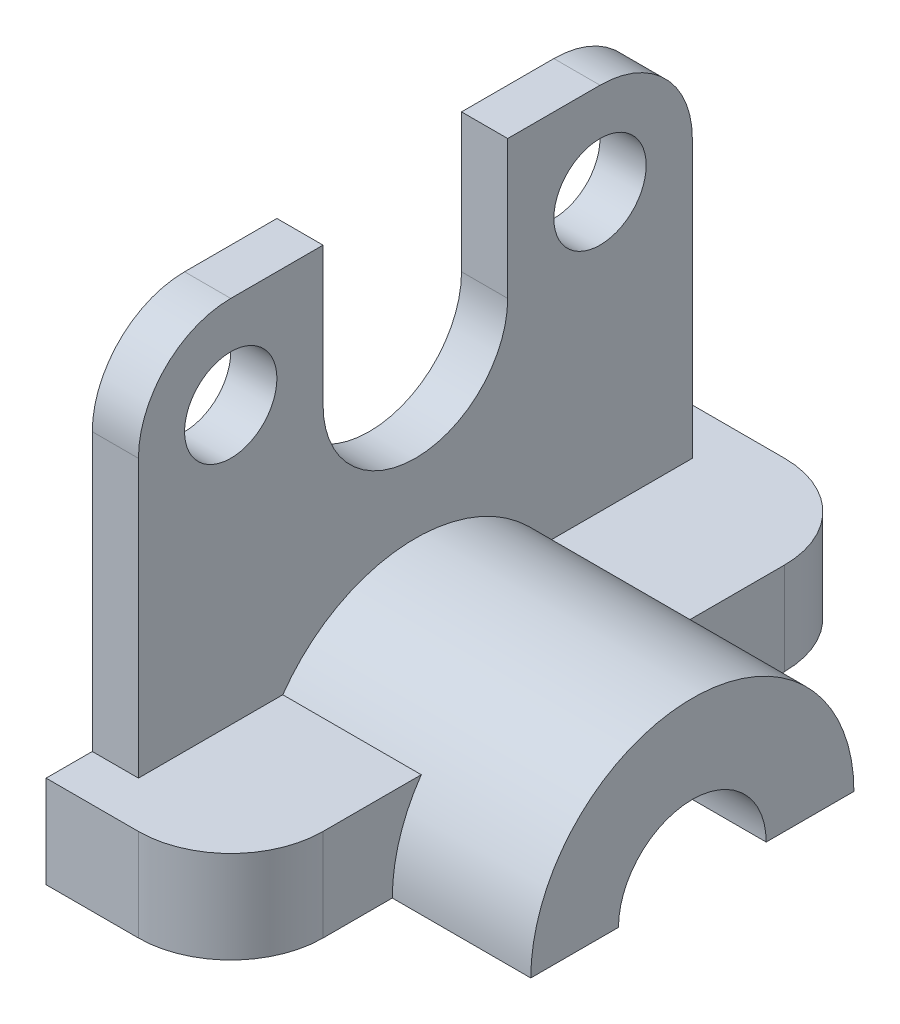
ISO-10303-21;
HEADER;
FILE_DESCRIPTION(('STEP AP214'),'2;1');
FILE_NAME('part.step','',(''),(''),'','','');
FILE_SCHEMA(('AUTOMOTIVE_DESIGN { 1 0 10303 214 1 1 1 1 }'));
ENDSEC;
DATA;
#1=APPLICATION_CONTEXT('core data for automotive mechanical design processes');
#2=APPLICATION_PROTOCOL_DEFINITION('international standard','automotive_design',2000,#1);
#3=PRODUCT_CONTEXT('',#1,'mechanical');
#4=PRODUCT('Part','Part','',(#3));
#5=PRODUCT_RELATED_PRODUCT_CATEGORY('part','',(#4));
#6=PRODUCT_DEFINITION_FORMATION('','',#4);
#7=PRODUCT_DEFINITION_CONTEXT('part definition',#1,'design');
#8=PRODUCT_DEFINITION('design','',#6,#7);
#9=PRODUCT_DEFINITION_SHAPE('','',#8);
#10=(LENGTH_UNIT() NAMED_UNIT(*) SI_UNIT(.MILLI.,.METRE.));
#11=(NAMED_UNIT(*) PLANE_ANGLE_UNIT() SI_UNIT($,.RADIAN.));
#12=(NAMED_UNIT(*) SI_UNIT($,.STERADIAN.) SOLID_ANGLE_UNIT());
#13=UNCERTAINTY_MEASURE_WITH_UNIT(LENGTH_MEASURE(1.E-05),#10,'distance_accuracy_value','');
#14=(GEOMETRIC_REPRESENTATION_CONTEXT(3) GLOBAL_UNCERTAINTY_ASSIGNED_CONTEXT((#13)) GLOBAL_UNIT_ASSIGNED_CONTEXT((#10,
#11,#12)) REPRESENTATION_CONTEXT('',''));
#15=CARTESIAN_POINT('',(0.,0.,0.));
#16=DIRECTION('',(0.,0.,1.));
#17=DIRECTION('',(1.,0.,0.));
#18=AXIS2_PLACEMENT_3D('',#15,#16,#17);
#19=CARTESIAN_POINT('',(20.,-10.,0.));
#20=DIRECTION('',(0.,-1.,0.));
#21=DIRECTION('',(0.,0.,-1.));
#22=AXIS2_PLACEMENT_3D('',#19,#20,#21);
#23=PLANE('',#22);
#24=DIRECTION('',(1.,0.,0.));
#25=VECTOR('',#24,1.);
#26=CARTESIAN_POINT('',(-34.1311896062463,-10.,-43.));
#27=LINE('',#26,#25);
#28=CARTESIAN_POINT('',(0.,-10.,-43.));
#29=VERTEX_POINT('',#28);
#30=CARTESIAN_POINT('',(35.,-10.,-43.));
#31=VERTEX_POINT('',#30);
#32=EDGE_CURVE('E184',#29,#31,#27,.T.);
#33=ORIENTED_EDGE('',*,*,#32,.F.);
#34=DIRECTION('',(0.,0.,1.));
#35=VECTOR('',#34,1.);
#36=CARTESIAN_POINT('',(0.,-10.,0.));
#37=LINE('',#36,#35);
#38=CARTESIAN_POINT('',(0.,-10.,-70.));
#39=VERTEX_POINT('',#38);
#40=EDGE_CURVE('E188',#39,#29,#37,.T.);
#41=ORIENTED_EDGE('',*,*,#40,.F.);
#42=DIRECTION('',(-1.,0.,0.));
#43=VECTOR('',#42,1.);
#44=CARTESIAN_POINT('',(20.,-10.,-70.));
#45=LINE('',#44,#43);
#46=CARTESIAN_POINT('',(10.,-10.,-70.));
#47=VERTEX_POINT('',#46);
#48=EDGE_CURVE('E225',#47,#39,#45,.T.);
#49=ORIENTED_EDGE('',*,*,#48,.F.);
#50=CARTESIAN_POINT('',(10.,-10.,-60.));
#51=DIRECTION('',(0.,-1.,0.));
#52=DIRECTION('',(0.,0.,-1.));
#53=AXIS2_PLACEMENT_3D('',#50,#51,#52);
#54=CIRCLE('',#53,10.);
#55=CARTESIAN_POINT('',(20.,-10.,-60.));
#56=VERTEX_POINT('',#55);
#57=EDGE_CURVE('E290',#47,#56,#54,.T.);
#58=ORIENTED_EDGE('',*,*,#57,.T.);
#59=DIRECTION('',(0.,0.,1.));
#60=VECTOR('',#59,1.);
#61=CARTESIAN_POINT('',(20.,-10.,0.));
#62=LINE('',#61,#60);
#63=CARTESIAN_POINT('',(20.,-10.,-52.5));
#64=VERTEX_POINT('',#63);
#65=EDGE_CURVE('E240',#56,#64,#62,.T.);
#66=ORIENTED_EDGE('',*,*,#65,.T.);
#67=DIRECTION('',(1.,0.,0.));
#68=VECTOR('',#67,1.);
#69=CARTESIAN_POINT('',(-34.1311896062463,-10.,-52.5));
#70=LINE('',#69,#68);
#71=CARTESIAN_POINT('',(35.,-10.,-52.5));
#72=VERTEX_POINT('',#71);
#73=EDGE_CURVE('E195',#64,#72,#70,.T.);
#74=ORIENTED_EDGE('',*,*,#73,.T.);
#75=DIRECTION('',(0.,0.,-1.));
#76=VECTOR('',#75,1.);
#77=CARTESIAN_POINT('',(35.,-10.,-43.));
#78=LINE('',#77,#76);
#79=EDGE_CURVE('E191',#31,#72,#78,.T.);
#80=ORIENTED_EDGE('',*,*,#79,.F.);
#81=EDGE_LOOP('',(#33,#41,#49,#58,#66,#74,#80));
#82=FACE_BOUND('',#81,.T.);
#83=ADVANCED_FACE('F33',(#82),#23,.T.);
#84=CARTESIAN_POINT('',(20.,0.,0.));
#85=DIRECTION('',(0.,1.,0.));
#86=DIRECTION('',(0.,0.,1.));
#87=AXIS2_PLACEMENT_3D('',#84,#85,#86);
#88=PLANE('',#87);
#89=DIRECTION('',(1.,0.,0.));
#90=VECTOR('',#89,1.);
#91=CARTESIAN_POINT('',(-34.1311896062463,0.,-20.6385933836549));
#92=LINE('',#91,#90);
#93=CARTESIAN_POINT('',(5.,0.,-20.6385933836549));
#94=VERTEX_POINT('',#93);
#95=CARTESIAN_POINT('',(20.,0.,-20.6385933836549));
#96=VERTEX_POINT('',#95);
#97=EDGE_CURVE('E307',#94,#96,#92,.T.);
#98=ORIENTED_EDGE('',*,*,#97,.F.);
#99=DIRECTION('',(0.,0.,-1.));
#100=VECTOR('',#99,1.);
#101=CARTESIAN_POINT('',(5.,0.,0.));
#102=LINE('',#101,#100);
#103=CARTESIAN_POINT('',(5.,0.,-5.));
#104=VERTEX_POINT('',#103);
#105=EDGE_CURVE('E315',#104,#94,#102,.T.);
#106=ORIENTED_EDGE('',*,*,#105,.F.);
#107=DIRECTION('',(-1.,0.,0.));
#108=VECTOR('',#107,1.);
#109=CARTESIAN_POINT('',(5.,0.,-5.));
#110=LINE('',#109,#108);
#111=CARTESIAN_POINT('',(0.,0.,-5.));
#112=VERTEX_POINT('',#111);
#113=EDGE_CURVE('E264',#104,#112,#110,.T.);
#114=ORIENTED_EDGE('',*,*,#113,.T.);
#115=DIRECTION('',(0.,0.,-1.));
#116=VECTOR('',#115,1.);
#117=CARTESIAN_POINT('',(0.,0.,0.));
#118=LINE('',#117,#116);
#119=CARTESIAN_POINT('',(0.,0.,0.));
#120=VERTEX_POINT('',#119);
#121=EDGE_CURVE('E222',#120,#112,#118,.T.);
#122=ORIENTED_EDGE('',*,*,#121,.F.);
#123=DIRECTION('',(-1.,0.,0.));
#124=VECTOR('',#123,1.);
#125=CARTESIAN_POINT('',(20.,0.,0.));
#126=LINE('',#125,#124);
#127=CARTESIAN_POINT('',(10.,0.,0.));
#128=VERTEX_POINT('',#127);
#129=EDGE_CURVE('E230',#128,#120,#126,.T.);
#130=ORIENTED_EDGE('',*,*,#129,.F.);
#131=CARTESIAN_POINT('',(10.,0.,-10.));
#132=DIRECTION('',(0.,1.,0.));
#133=DIRECTION('',(0.,0.,1.));
#134=AXIS2_PLACEMENT_3D('',#131,#132,#133);
#135=CIRCLE('',#134,10.);
#136=CARTESIAN_POINT('',(20.,0.,-10.));
#137=VERTEX_POINT('',#136);
#138=EDGE_CURVE('E297',#128,#137,#135,.T.);
#139=ORIENTED_EDGE('',*,*,#138,.T.);
#140=DIRECTION('',(0.,0.,-1.));
#141=VECTOR('',#140,1.);
#142=CARTESIAN_POINT('',(20.,0.,0.));
#143=LINE('',#142,#141);
#144=EDGE_CURVE('E211',#137,#96,#143,.T.);
#145=ORIENTED_EDGE('',*,*,#144,.T.);
#146=EDGE_LOOP('',(#98,#106,#114,#122,#130,#139,#145));
#147=FACE_BOUND('',#146,.T.);
#148=ADVANCED_FACE('F418',(#147),#88,.T.);
#149=CARTESIAN_POINT('',(20.,0.,0.));
#150=DIRECTION('',(1.,0.,0.));
#151=DIRECTION('',(0.,0.,-1.));
#152=AXIS2_PLACEMENT_3D('',#149,#150,#151);
#153=PLANE('',#152);
#154=CARTESIAN_POINT('',(20.,-10.,-35.));
#155=DIRECTION('',(1.,0.,0.));
#156=DIRECTION('',(0.,0.,-1.));
#157=AXIS2_PLACEMENT_3D('',#154,#155,#156);
#158=CIRCLE('',#157,17.5);
#159=CARTESIAN_POINT('',(20.,0.,-49.3614066163451));
#160=VERTEX_POINT('',#159);
#161=EDGE_CURVE('E405',#64,#160,#158,.T.);
#162=ORIENTED_EDGE('',*,*,#161,.F.);
#163=ORIENTED_EDGE('',*,*,#65,.F.);
#164=DIRECTION('',(0.,-1.,0.));
#165=VECTOR('',#164,1.);
#166=CARTESIAN_POINT('',(20.,0.,-60.));
#167=LINE('',#166,#165);
#168=CARTESIAN_POINT('',(20.,0.,-60.));
#169=VERTEX_POINT('',#168);
#170=EDGE_CURVE('E295',#56,#169,#167,.F.);
#171=ORIENTED_EDGE('',*,*,#170,.T.);
#172=EDGE_CURVE('E236',#160,#169,#143,.T.);
#173=ORIENTED_EDGE('',*,*,#172,.F.);
#174=EDGE_LOOP('',(#162,#163,#171,#173));
#175=FACE_BOUND('',#174,.T.);
#176=ADVANCED_FACE('F403',(#175),#153,.T.);
#177=CARTESIAN_POINT('',(20.,-10.,-17.5));
#178=VERTEX_POINT('',#177);
#179=EDGE_CURVE('E56',#96,#178,#158,.T.);
#180=ORIENTED_EDGE('',*,*,#179,.F.);
#181=ORIENTED_EDGE('',*,*,#144,.F.);
#182=DIRECTION('',(0.,1.,0.));
#183=VECTOR('',#182,1.);
#184=CARTESIAN_POINT('',(20.,0.,-10.));
#185=LINE('',#184,#183);
#186=CARTESIAN_POINT('',(20.,-10.,-10.));
#187=VERTEX_POINT('',#186);
#188=EDGE_CURVE('E292',#137,#187,#185,.F.);
#189=ORIENTED_EDGE('',*,*,#188,.T.);
#190=EDGE_CURVE('E243',#178,#187,#62,.T.);
#191=ORIENTED_EDGE('',*,*,#190,.F.);
#192=EDGE_LOOP('',(#180,#181,#189,#191));
#193=FACE_BOUND('',#192,.T.);
#194=ADVANCED_FACE('F426',(#193),#153,.T.);
#195=CARTESIAN_POINT('',(0.,-10.,-27.));
#196=VERTEX_POINT('',#195);
#197=CARTESIAN_POINT('',(0.,-10.,0.));
#198=VERTEX_POINT('',#197);
#199=EDGE_CURVE('E205',#196,#198,#37,.T.);
#200=ORIENTED_EDGE('',*,*,#199,.F.);
#201=DIRECTION('',(1.,0.,0.));
#202=VECTOR('',#201,1.);
#203=CARTESIAN_POINT('',(-34.1311896062463,-10.,-27.));
#204=LINE('',#203,#202);
#205=CARTESIAN_POINT('',(35.,-10.,-27.));
#206=VERTEX_POINT('',#205);
#207=EDGE_CURVE('E196',#196,#206,#204,.T.);
#208=ORIENTED_EDGE('',*,*,#207,.T.);
#209=DIRECTION('',(0.,0.,-1.));
#210=VECTOR('',#209,1.);
#211=CARTESIAN_POINT('',(35.,-10.,-17.5));
#212=LINE('',#211,#210);
#213=CARTESIAN_POINT('',(35.,-10.,-17.5));
#214=VERTEX_POINT('',#213);
#215=EDGE_CURVE('E663',#214,#206,#212,.T.);
#216=ORIENTED_EDGE('',*,*,#215,.F.);
#217=DIRECTION('',(1.,0.,0.));
#218=VECTOR('',#217,1.);
#219=CARTESIAN_POINT('',(-34.1311896062463,-10.,-17.5));
#220=LINE('',#219,#218);
#221=EDGE_CURVE('E670',#178,#214,#220,.T.);
#222=ORIENTED_EDGE('',*,*,#221,.F.);
#223=ORIENTED_EDGE('',*,*,#190,.T.);
#224=CARTESIAN_POINT('',(10.,-10.,-10.));
#225=DIRECTION('',(0.,-1.,0.));
#226=DIRECTION('',(0.,0.,-1.));
#227=AXIS2_PLACEMENT_3D('',#224,#225,#226);
#228=CIRCLE('',#227,10.);
#229=CARTESIAN_POINT('',(10.,-10.,0.));
#230=VERTEX_POINT('',#229);
#231=EDGE_CURVE('E288',#187,#230,#228,.T.);
#232=ORIENTED_EDGE('',*,*,#231,.T.);
#233=DIRECTION('',(-1.,0.,0.));
#234=VECTOR('',#233,1.);
#235=CARTESIAN_POINT('',(20.,-10.,0.));
#236=LINE('',#235,#234);
#237=EDGE_CURVE('E231',#230,#198,#236,.T.);
#238=ORIENTED_EDGE('',*,*,#237,.T.);
#239=EDGE_LOOP('',(#200,#208,#216,#222,#223,#232,#238));
#240=FACE_BOUND('',#239,.T.);
#241=ADVANCED_FACE('F419',(#240),#23,.T.);
#242=CARTESIAN_POINT('',(20.,0.,-70.));
#243=DIRECTION('',(0.,0.,-1.));
#244=DIRECTION('',(-1.,0.,0.));
#245=AXIS2_PLACEMENT_3D('',#242,#243,#244);
#246=PLANE('',#245);
#247=DIRECTION('',(-1.,0.,0.));
#248=VECTOR('',#247,1.);
#249=CARTESIAN_POINT('',(20.,0.,-70.));
#250=LINE('',#249,#248);
#251=CARTESIAN_POINT('',(10.,0.,-70.));
#252=VERTEX_POINT('',#251);
#253=CARTESIAN_POINT('',(0.,0.,-70.));
#254=VERTEX_POINT('',#253);
#255=EDGE_CURVE('E228',#252,#254,#250,.T.);
#256=ORIENTED_EDGE('',*,*,#255,.F.);
#257=DIRECTION('',(0.,-1.,0.));
#258=VECTOR('',#257,1.);
#259=CARTESIAN_POINT('',(10.,0.,-70.));
#260=LINE('',#259,#258);
#261=EDGE_CURVE('E227',#252,#47,#260,.T.);
#262=ORIENTED_EDGE('',*,*,#261,.T.);
#263=ORIENTED_EDGE('',*,*,#48,.T.);
#264=DIRECTION('',(0.,-1.,0.));
#265=VECTOR('',#264,1.);
#266=CARTESIAN_POINT('',(0.,0.,-70.));
#267=LINE('',#266,#265);
#268=EDGE_CURVE('E204',#254,#39,#267,.T.);
#269=ORIENTED_EDGE('',*,*,#268,.F.);
#270=EDGE_LOOP('',(#256,#262,#263,#269));
#271=FACE_BOUND('',#270,.T.);
#272=ADVANCED_FACE('F398',(#271),#246,.T.);
#273=DIRECTION('',(1.,0.,0.));
#274=VECTOR('',#273,1.);
#275=CARTESIAN_POINT('',(-34.1311896062463,0.,-49.3614066163451));
#276=LINE('',#275,#274);
#277=CARTESIAN_POINT('',(5.,0.,-49.3614066163451));
#278=VERTEX_POINT('',#277);
#279=EDGE_CURVE('E48',#160,#278,#276,.F.);
#280=ORIENTED_EDGE('',*,*,#279,.F.);
#281=ORIENTED_EDGE('',*,*,#172,.T.);
#282=CARTESIAN_POINT('',(10.,0.,-60.));
#283=DIRECTION('',(0.,1.,0.));
#284=DIRECTION('',(0.,0.,1.));
#285=AXIS2_PLACEMENT_3D('',#282,#283,#284);
#286=CIRCLE('',#285,10.);
#287=EDGE_CURVE('E299',#169,#252,#286,.T.);
#288=ORIENTED_EDGE('',*,*,#287,.T.);
#289=ORIENTED_EDGE('',*,*,#255,.T.);
#290=CARTESIAN_POINT('',(0.,0.,-65.));
#291=VERTEX_POINT('',#290);
#292=EDGE_CURVE('E207',#291,#254,#118,.T.);
#293=ORIENTED_EDGE('',*,*,#292,.F.);
#294=DIRECTION('',(-1.,0.,0.));
#295=VECTOR('',#294,1.);
#296=CARTESIAN_POINT('',(5.,0.,-65.));
#297=LINE('',#296,#295);
#298=CARTESIAN_POINT('',(5.,0.,-65.));
#299=VERTEX_POINT('',#298);
#300=EDGE_CURVE('E209',#299,#291,#297,.T.);
#301=ORIENTED_EDGE('',*,*,#300,.F.);
#302=EDGE_CURVE('E311',#278,#299,#102,.T.);
#303=ORIENTED_EDGE('',*,*,#302,.F.);
#304=EDGE_LOOP('',(#280,#281,#288,#289,#293,#301,#303));
#305=FACE_BOUND('',#304,.T.);
#306=ADVANCED_FACE('F317',(#305),#88,.T.);
#307=CARTESIAN_POINT('',(20.,0.,0.));
#308=DIRECTION('',(0.,0.,1.));
#309=DIRECTION('',(1.,0.,0.));
#310=AXIS2_PLACEMENT_3D('',#307,#308,#309);
#311=PLANE('',#310);
#312=ORIENTED_EDGE('',*,*,#237,.F.);
#313=DIRECTION('',(0.,1.,0.));
#314=VECTOR('',#313,1.);
#315=CARTESIAN_POINT('',(10.,0.,0.));
#316=LINE('',#315,#314);
#317=EDGE_CURVE('E301',#230,#128,#316,.T.);
#318=ORIENTED_EDGE('',*,*,#317,.T.);
#319=ORIENTED_EDGE('',*,*,#129,.T.);
#320=DIRECTION('',(0.,1.,0.));
#321=VECTOR('',#320,1.);
#322=CARTESIAN_POINT('',(0.,0.,0.));
#323=LINE('',#322,#321);
#324=EDGE_CURVE('E216',#198,#120,#323,.T.);
#325=ORIENTED_EDGE('',*,*,#324,.F.);
#326=EDGE_LOOP('',(#312,#318,#319,#325));
#327=FACE_BOUND('',#326,.T.);
#328=ADVANCED_FACE('F436',(#327),#311,.T.);
#329=CARTESIAN_POINT('',(0.,0.,0.));
#330=DIRECTION('',(1.,0.,0.));
#331=DIRECTION('',(0.,0.,-1.));
#332=AXIS2_PLACEMENT_3D('',#329,#330,#331);
#333=PLANE('',#332);
#334=CARTESIAN_POINT('',(0.,30.,-55.));
#335=DIRECTION('',(1.,0.,0.));
#336=DIRECTION('',(0.,0.,-1.));
#337=AXIS2_PLACEMENT_3D('',#334,#335,#336);
#338=CIRCLE('',#337,5.);
#339=CARTESIAN_POINT('',(0.,30.,-60.));
#340=VERTEX_POINT('',#339);
#341=EDGE_CURVE('E680',#340,#340,#338,.T.);
#342=ORIENTED_EDGE('',*,*,#341,.T.);
#343=EDGE_LOOP('',(#342));
#344=FACE_BOUND('',#343,.T.);
#345=CARTESIAN_POINT('',(0.,30.,-15.));
#346=DIRECTION('',(1.,0.,0.));
#347=DIRECTION('',(0.,0.,-1.));
#348=AXIS2_PLACEMENT_3D('',#345,#346,#347);
#349=CIRCLE('',#348,5.);
#350=CARTESIAN_POINT('',(0.,30.,-20.));
#351=VERTEX_POINT('',#350);
#352=EDGE_CURVE('E279',#351,#351,#349,.T.);
#353=ORIENTED_EDGE('',*,*,#352,.T.);
#354=EDGE_LOOP('',(#353));
#355=FACE_BOUND('',#354,.T.);
#356=ORIENTED_EDGE('',*,*,#40,.T.);
#357=CARTESIAN_POINT('',(0.,-10.,-35.));
#358=DIRECTION('',(1.,0.,0.));
#359=DIRECTION('',(0.,0.,-1.));
#360=AXIS2_PLACEMENT_3D('',#357,#358,#359);
#361=CIRCLE('',#360,8.);
#362=EDGE_CURVE('E11',#29,#196,#361,.T.);
#363=ORIENTED_EDGE('',*,*,#362,.T.);
#364=ORIENTED_EDGE('',*,*,#199,.T.);
#365=ORIENTED_EDGE('',*,*,#324,.T.);
#366=ORIENTED_EDGE('',*,*,#121,.T.);
#367=DIRECTION('',(0.,1.,0.));
#368=VECTOR('',#367,1.);
#369=CARTESIAN_POINT('',(0.,0.,-5.));
#370=LINE('',#369,#368);
#371=CARTESIAN_POINT('',(0.,30.,-5.));
#372=VERTEX_POINT('',#371);
#373=EDGE_CURVE('E319',#112,#372,#370,.T.);
#374=ORIENTED_EDGE('',*,*,#373,.T.);
#375=CARTESIAN_POINT('',(0.,30.,-15.));
#376=DIRECTION('',(1.,0.,0.));
#377=DIRECTION('',(0.,0.,-1.));
#378=AXIS2_PLACEMENT_3D('',#375,#376,#377);
#379=CIRCLE('',#378,9.99999999999999);
#380=CARTESIAN_POINT('',(0.,40.,-15.));
#381=VERTEX_POINT('',#380);
#382=EDGE_CURVE('E267',#372,#381,#379,.F.);
#383=ORIENTED_EDGE('',*,*,#382,.T.);
#384=DIRECTION('',(0.,0.,-1.));
#385=VECTOR('',#384,1.);
#386=CARTESIAN_POINT('',(0.,40.,0.));
#387=LINE('',#386,#385);
#388=CARTESIAN_POINT('',(0.,40.,-25.));
#389=VERTEX_POINT('',#388);
#390=EDGE_CURVE('E360',#381,#389,#387,.T.);
#391=ORIENTED_EDGE('',*,*,#390,.T.);
#392=DIRECTION('',(0.,-1.,0.));
#393=VECTOR('',#392,1.);
#394=CARTESIAN_POINT('',(0.,0.,-25.));
#395=LINE('',#394,#393);
#396=CARTESIAN_POINT('',(0.,25.,-25.));
#397=VERTEX_POINT('',#396);
#398=EDGE_CURVE('E358',#389,#397,#395,.T.);
#399=ORIENTED_EDGE('',*,*,#398,.T.);
#400=CARTESIAN_POINT('',(0.,25.,-35.));
#401=DIRECTION('',(1.,0.,0.));
#402=DIRECTION('',(0.,0.,-1.));
#403=AXIS2_PLACEMENT_3D('',#400,#401,#402);
#404=CIRCLE('',#403,10.);
#405=CARTESIAN_POINT('',(0.,25.,-45.));
#406=VERTEX_POINT('',#405);
#407=EDGE_CURVE('E355',#397,#406,#404,.T.);
#408=ORIENTED_EDGE('',*,*,#407,.T.);
#409=DIRECTION('',(0.,-1.,0.));
#410=VECTOR('',#409,1.);
#411=CARTESIAN_POINT('',(0.,0.,-45.));
#412=LINE('',#411,#410);
#413=CARTESIAN_POINT('',(0.,40.,-45.));
#414=VERTEX_POINT('',#413);
#415=EDGE_CURVE('E352',#414,#406,#412,.T.);
#416=ORIENTED_EDGE('',*,*,#415,.F.);
#417=DIRECTION('',(0.,0.,1.));
#418=VECTOR('',#417,1.);
#419=CARTESIAN_POINT('',(0.,40.,0.));
#420=LINE('',#419,#418);
#421=CARTESIAN_POINT('',(0.,40.,-55.));
#422=VERTEX_POINT('',#421);
#423=EDGE_CURVE('E350',#422,#414,#420,.T.);
#424=ORIENTED_EDGE('',*,*,#423,.F.);
#425=CARTESIAN_POINT('',(0.,30.,-55.));
#426=DIRECTION('',(1.,0.,0.));
#427=DIRECTION('',(0.,0.,-1.));
#428=AXIS2_PLACEMENT_3D('',#425,#426,#427);
#429=CIRCLE('',#428,9.99999999999999);
#430=CARTESIAN_POINT('',(0.,30.,-65.));
#431=VERTEX_POINT('',#430);
#432=EDGE_CURVE('E278',#422,#431,#429,.F.);
#433=ORIENTED_EDGE('',*,*,#432,.T.);
#434=DIRECTION('',(0.,1.,0.));
#435=VECTOR('',#434,1.);
#436=CARTESIAN_POINT('',(0.,0.,-65.));
#437=LINE('',#436,#435);
#438=EDGE_CURVE('E275',#291,#431,#437,.T.);
#439=ORIENTED_EDGE('',*,*,#438,.F.);
#440=ORIENTED_EDGE('',*,*,#292,.T.);
#441=ORIENTED_EDGE('',*,*,#268,.T.);
#442=EDGE_LOOP('',(#356,#363,#364,#365,#366,#374,#383,#391,#399,#408,#416,#424,#433,#439,#440,#441));
#443=FACE_BOUND('',#442,.T.);
#444=ADVANCED_FACE('F201',(#344,#355,#443),#333,.F.);
#445=CARTESIAN_POINT('',(5.,0.,-65.));
#446=DIRECTION('',(0.,0.,1.));
#447=DIRECTION('',(1.,0.,0.));
#448=AXIS2_PLACEMENT_3D('',#445,#446,#447);
#449=PLANE('',#448);
#450=ORIENTED_EDGE('',*,*,#438,.T.);
#451=DIRECTION('',(-1.,0.,0.));
#452=VECTOR('',#451,1.);
#453=CARTESIAN_POINT('',(5.,30.,-65.));
#454=LINE('',#453,#452);
#455=CARTESIAN_POINT('',(5.,30.,-65.));
#456=VERTEX_POINT('',#455);
#457=EDGE_CURVE('E247',#456,#431,#454,.T.);
#458=ORIENTED_EDGE('',*,*,#457,.F.);
#459=DIRECTION('',(0.,1.,0.));
#460=VECTOR('',#459,1.);
#461=CARTESIAN_POINT('',(5.,0.,-65.));
#462=LINE('',#461,#460);
#463=EDGE_CURVE('E321',#299,#456,#462,.T.);
#464=ORIENTED_EDGE('',*,*,#463,.F.);
#465=ORIENTED_EDGE('',*,*,#300,.T.);
#466=EDGE_LOOP('',(#450,#458,#464,#465));
#467=FACE_BOUND('',#466,.T.);
#468=ADVANCED_FACE('F395',(#467),#449,.F.);
#469=CARTESIAN_POINT('',(5.,30.,-55.));
#470=DIRECTION('',(-1.,0.,0.));
#471=DIRECTION('',(0.,0.,1.));
#472=AXIS2_PLACEMENT_3D('',#469,#470,#471);
#473=CYLINDRICAL_SURFACE('',#472,9.99999999999999);
#474=ORIENTED_EDGE('',*,*,#432,.F.);
#475=DIRECTION('',(-1.,0.,0.));
#476=VECTOR('',#475,1.);
#477=CARTESIAN_POINT('',(5.,40.,-55.));
#478=LINE('',#477,#476);
#479=CARTESIAN_POINT('',(5.,40.,-55.));
#480=VERTEX_POINT('',#479);
#481=EDGE_CURVE('E249',#480,#422,#478,.T.);
#482=ORIENTED_EDGE('',*,*,#481,.F.);
#483=CARTESIAN_POINT('',(5.,30.,-55.));
#484=DIRECTION('',(1.,0.,0.));
#485=DIRECTION('',(0.,0.,-1.));
#486=AXIS2_PLACEMENT_3D('',#483,#484,#485);
#487=CIRCLE('',#486,9.99999999999999);
#488=EDGE_CURVE('E327',#480,#456,#487,.F.);
#489=ORIENTED_EDGE('',*,*,#488,.T.);
#490=ORIENTED_EDGE('',*,*,#457,.T.);
#491=EDGE_LOOP('',(#474,#482,#489,#490));
#492=FACE_BOUND('',#491,.T.);
#493=ADVANCED_FACE('F392',(#492),#473,.T.);
#494=CARTESIAN_POINT('',(5.,40.,0.));
#495=DIRECTION('',(0.,-1.,0.));
#496=DIRECTION('',(0.,0.,-1.));
#497=AXIS2_PLACEMENT_3D('',#494,#495,#496);
#498=PLANE('',#497);
#499=ORIENTED_EDGE('',*,*,#423,.T.);
#500=DIRECTION('',(-1.,0.,0.));
#501=VECTOR('',#500,1.);
#502=CARTESIAN_POINT('',(5.,40.,-45.));
#503=LINE('',#502,#501);
#504=CARTESIAN_POINT('',(5.,40.,-45.));
#505=VERTEX_POINT('',#504);
#506=EDGE_CURVE('E251',#505,#414,#503,.T.);
#507=ORIENTED_EDGE('',*,*,#506,.F.);
#508=DIRECTION('',(0.,0.,1.));
#509=VECTOR('',#508,1.);
#510=CARTESIAN_POINT('',(5.,40.,0.));
#511=LINE('',#510,#509);
#512=EDGE_CURVE('E330',#480,#505,#511,.T.);
#513=ORIENTED_EDGE('',*,*,#512,.F.);
#514=ORIENTED_EDGE('',*,*,#481,.T.);
#515=EDGE_LOOP('',(#499,#507,#513,#514));
#516=FACE_BOUND('',#515,.T.);
#517=ADVANCED_FACE('F388',(#516),#498,.F.);
#518=CARTESIAN_POINT('',(5.,0.,-45.));
#519=DIRECTION('',(0.,0.,-1.));
#520=DIRECTION('',(-1.,0.,0.));
#521=AXIS2_PLACEMENT_3D('',#518,#519,#520);
#522=PLANE('',#521);
#523=ORIENTED_EDGE('',*,*,#415,.T.);
#524=DIRECTION('',(-1.,0.,0.));
#525=VECTOR('',#524,1.);
#526=CARTESIAN_POINT('',(5.,25.,-45.));
#527=LINE('',#526,#525);
#528=CARTESIAN_POINT('',(5.,25.,-45.));
#529=VERTEX_POINT('',#528);
#530=EDGE_CURVE('E254',#529,#406,#527,.T.);
#531=ORIENTED_EDGE('',*,*,#530,.F.);
#532=DIRECTION('',(0.,-1.,0.));
#533=VECTOR('',#532,1.);
#534=CARTESIAN_POINT('',(5.,0.,-45.));
#535=LINE('',#534,#533);
#536=EDGE_CURVE('E332',#505,#529,#535,.T.);
#537=ORIENTED_EDGE('',*,*,#536,.F.);
#538=ORIENTED_EDGE('',*,*,#506,.T.);
#539=EDGE_LOOP('',(#523,#531,#537,#538));
#540=FACE_BOUND('',#539,.T.);
#541=ADVANCED_FACE('F384',(#540),#522,.F.);
#542=CARTESIAN_POINT('',(5.,25.,-35.));
#543=DIRECTION('',(-1.,0.,0.));
#544=DIRECTION('',(0.,0.,1.));
#545=AXIS2_PLACEMENT_3D('',#542,#543,#544);
#546=CYLINDRICAL_SURFACE('',#545,10.);
#547=ORIENTED_EDGE('',*,*,#407,.F.);
#548=DIRECTION('',(-1.,0.,0.));
#549=VECTOR('',#548,1.);
#550=CARTESIAN_POINT('',(5.,25.,-25.));
#551=LINE('',#550,#549);
#552=CARTESIAN_POINT('',(5.,25.,-25.));
#553=VERTEX_POINT('',#552);
#554=EDGE_CURVE('E256',#553,#397,#551,.T.);
#555=ORIENTED_EDGE('',*,*,#554,.F.);
#556=CARTESIAN_POINT('',(5.,25.,-35.));
#557=DIRECTION('',(1.,0.,0.));
#558=DIRECTION('',(0.,0.,-1.));
#559=AXIS2_PLACEMENT_3D('',#556,#557,#558);
#560=CIRCLE('',#559,10.);
#561=EDGE_CURVE('E334',#553,#529,#560,.T.);
#562=ORIENTED_EDGE('',*,*,#561,.T.);
#563=ORIENTED_EDGE('',*,*,#530,.T.);
#564=EDGE_LOOP('',(#547,#555,#562,#563));
#565=FACE_BOUND('',#564,.T.);
#566=ADVANCED_FACE('F379',(#565),#546,.F.);
#567=CARTESIAN_POINT('',(5.,0.,-25.));
#568=DIRECTION('',(0.,0.,-1.));
#569=DIRECTION('',(0.,1.,0.));
#570=AXIS2_PLACEMENT_3D('',#567,#568,#569);
#571=PLANE('',#570);
#572=ORIENTED_EDGE('',*,*,#398,.F.);
#573=DIRECTION('',(-1.,0.,0.));
#574=VECTOR('',#573,1.);
#575=CARTESIAN_POINT('',(5.,40.,-25.));
#576=LINE('',#575,#574);
#577=CARTESIAN_POINT('',(5.,40.,-25.));
#578=VERTEX_POINT('',#577);
#579=EDGE_CURVE('E258',#578,#389,#576,.T.);
#580=ORIENTED_EDGE('',*,*,#579,.F.);
#581=DIRECTION('',(0.,-1.,0.));
#582=VECTOR('',#581,1.);
#583=CARTESIAN_POINT('',(5.,0.,-25.));
#584=LINE('',#583,#582);
#585=EDGE_CURVE('E337',#578,#553,#584,.T.);
#586=ORIENTED_EDGE('',*,*,#585,.T.);
#587=ORIENTED_EDGE('',*,*,#554,.T.);
#588=EDGE_LOOP('',(#572,#580,#586,#587));
#589=FACE_BOUND('',#588,.T.);
#590=ADVANCED_FACE('F374',(#589),#571,.T.);
#591=CARTESIAN_POINT('',(5.,40.,0.));
#592=DIRECTION('',(0.,1.,0.));
#593=DIRECTION('',(0.,0.,1.));
#594=AXIS2_PLACEMENT_3D('',#591,#592,#593);
#595=PLANE('',#594);
#596=ORIENTED_EDGE('',*,*,#390,.F.);
#597=DIRECTION('',(-1.,0.,0.));
#598=VECTOR('',#597,1.);
#599=CARTESIAN_POINT('',(5.,40.,-15.));
#600=LINE('',#599,#598);
#601=CARTESIAN_POINT('',(5.,40.,-15.));
#602=VERTEX_POINT('',#601);
#603=EDGE_CURVE('E260',#602,#381,#600,.T.);
#604=ORIENTED_EDGE('',*,*,#603,.F.);
#605=DIRECTION('',(0.,0.,-1.));
#606=VECTOR('',#605,1.);
#607=CARTESIAN_POINT('',(5.,40.,0.));
#608=LINE('',#607,#606);
#609=EDGE_CURVE('E340',#602,#578,#608,.T.);
#610=ORIENTED_EDGE('',*,*,#609,.T.);
#611=ORIENTED_EDGE('',*,*,#579,.T.);
#612=EDGE_LOOP('',(#596,#604,#610,#611));
#613=FACE_BOUND('',#612,.T.);
#614=ADVANCED_FACE('F370',(#613),#595,.T.);
#615=CARTESIAN_POINT('',(5.,30.,-15.));
#616=DIRECTION('',(-1.,0.,0.));
#617=DIRECTION('',(0.,0.,1.));
#618=AXIS2_PLACEMENT_3D('',#615,#616,#617);
#619=CYLINDRICAL_SURFACE('',#618,9.99999999999999);
#620=ORIENTED_EDGE('',*,*,#382,.F.);
#621=DIRECTION('',(-1.,0.,0.));
#622=VECTOR('',#621,1.);
#623=CARTESIAN_POINT('',(5.,30.,-5.));
#624=LINE('',#623,#622);
#625=CARTESIAN_POINT('',(5.,30.,-5.));
#626=VERTEX_POINT('',#625);
#627=EDGE_CURVE('E262',#626,#372,#624,.T.);
#628=ORIENTED_EDGE('',*,*,#627,.F.);
#629=CARTESIAN_POINT('',(5.,30.,-15.));
#630=DIRECTION('',(1.,0.,0.));
#631=DIRECTION('',(0.,0.,-1.));
#632=AXIS2_PLACEMENT_3D('',#629,#630,#631);
#633=CIRCLE('',#632,9.99999999999999);
#634=EDGE_CURVE('E343',#626,#602,#633,.F.);
#635=ORIENTED_EDGE('',*,*,#634,.T.);
#636=ORIENTED_EDGE('',*,*,#603,.T.);
#637=EDGE_LOOP('',(#620,#628,#635,#636));
#638=FACE_BOUND('',#637,.T.);
#639=ADVANCED_FACE('F366',(#638),#619,.T.);
#640=CARTESIAN_POINT('',(5.,0.,-5.));
#641=DIRECTION('',(0.,0.,1.));
#642=DIRECTION('',(1.,0.,0.));
#643=AXIS2_PLACEMENT_3D('',#640,#641,#642);
#644=PLANE('',#643);
#645=ORIENTED_EDGE('',*,*,#373,.F.);
#646=ORIENTED_EDGE('',*,*,#113,.F.);
#647=DIRECTION('',(0.,1.,0.));
#648=VECTOR('',#647,1.);
#649=CARTESIAN_POINT('',(5.,0.,-5.));
#650=LINE('',#649,#648);
#651=EDGE_CURVE('E273',#104,#626,#650,.T.);
#652=ORIENTED_EDGE('',*,*,#651,.T.);
#653=ORIENTED_EDGE('',*,*,#627,.T.);
#654=EDGE_LOOP('',(#645,#646,#652,#653));
#655=FACE_BOUND('',#654,.T.);
#656=ADVANCED_FACE('F414',(#655),#644,.T.);
#657=CARTESIAN_POINT('',(5.,0.,0.));
#658=DIRECTION('',(1.,0.,0.));
#659=DIRECTION('',(0.,0.,-1.));
#660=AXIS2_PLACEMENT_3D('',#657,#658,#659);
#661=PLANE('',#660);
#662=CARTESIAN_POINT('',(5.,-10.,-35.));
#663=DIRECTION('',(1.,0.,0.));
#664=DIRECTION('',(0.,0.,-1.));
#665=AXIS2_PLACEMENT_3D('',#662,#663,#664);
#666=CIRCLE('',#665,17.5);
#667=EDGE_CURVE('E41',#278,#94,#666,.T.);
#668=ORIENTED_EDGE('',*,*,#667,.F.);
#669=ORIENTED_EDGE('',*,*,#302,.T.);
#670=ORIENTED_EDGE('',*,*,#463,.T.);
#671=ORIENTED_EDGE('',*,*,#488,.F.);
#672=ORIENTED_EDGE('',*,*,#512,.T.);
#673=ORIENTED_EDGE('',*,*,#536,.T.);
#674=ORIENTED_EDGE('',*,*,#561,.F.);
#675=ORIENTED_EDGE('',*,*,#585,.F.);
#676=ORIENTED_EDGE('',*,*,#609,.F.);
#677=ORIENTED_EDGE('',*,*,#634,.F.);
#678=ORIENTED_EDGE('',*,*,#651,.F.);
#679=ORIENTED_EDGE('',*,*,#105,.T.);
#680=EDGE_LOOP('',(#668,#669,#670,#671,#672,#673,#674,#675,#676,#677,#678,#679));
#681=FACE_BOUND('',#680,.T.);
#682=CARTESIAN_POINT('',(5.,30.,-55.));
#683=DIRECTION('',(1.,0.,0.));
#684=DIRECTION('',(0.,0.,1.));
#685=AXIS2_PLACEMENT_3D('',#682,#683,#684);
#686=CIRCLE('',#685,5.);
#687=CARTESIAN_POINT('',(5.,30.,-50.));
#688=VERTEX_POINT('',#687);
#689=EDGE_CURVE('E677',#688,#688,#686,.T.);
#690=ORIENTED_EDGE('',*,*,#689,.F.);
#691=EDGE_LOOP('',(#690));
#692=FACE_BOUND('',#691,.T.);
#693=CARTESIAN_POINT('',(5.,30.,-15.));
#694=DIRECTION('',(1.,0.,0.));
#695=DIRECTION('',(0.,0.,-1.));
#696=AXIS2_PLACEMENT_3D('',#693,#694,#695);
#697=CIRCLE('',#696,5.);
#698=CARTESIAN_POINT('',(5.,30.,-20.));
#699=VERTEX_POINT('',#698);
#700=EDGE_CURVE('E682',#699,#699,#697,.T.);
#701=ORIENTED_EDGE('',*,*,#700,.F.);
#702=EDGE_LOOP('',(#701));
#703=FACE_BOUND('',#702,.T.);
#704=ADVANCED_FACE('F309',(#681,#692,#703),#661,.T.);
#705=CARTESIAN_POINT('',(10.,0.,-60.));
#706=DIRECTION('',(0.,-1.,0.));
#707=DIRECTION('',(0.,0.,-1.));
#708=AXIS2_PLACEMENT_3D('',#705,#706,#707);
#709=CYLINDRICAL_SURFACE('',#708,10.);
#710=ORIENTED_EDGE('',*,*,#287,.F.);
#711=ORIENTED_EDGE('',*,*,#170,.F.);
#712=ORIENTED_EDGE('',*,*,#57,.F.);
#713=ORIENTED_EDGE('',*,*,#261,.F.);
#714=EDGE_LOOP('',(#710,#711,#712,#713));
#715=FACE_BOUND('',#714,.T.);
#716=ADVANCED_FACE('F406',(#715),#709,.T.);
#717=CARTESIAN_POINT('',(10.,0.,-10.));
#718=DIRECTION('',(0.,1.,0.));
#719=DIRECTION('',(0.,0.,1.));
#720=AXIS2_PLACEMENT_3D('',#717,#718,#719);
#721=CYLINDRICAL_SURFACE('',#720,10.);
#722=ORIENTED_EDGE('',*,*,#231,.F.);
#723=ORIENTED_EDGE('',*,*,#188,.F.);
#724=ORIENTED_EDGE('',*,*,#138,.F.);
#725=ORIENTED_EDGE('',*,*,#317,.F.);
#726=EDGE_LOOP('',(#722,#723,#724,#725));
#727=FACE_BOUND('',#726,.T.);
#728=ADVANCED_FACE('F35',(#727),#721,.T.);
#729=CARTESIAN_POINT('',(-4.99999999997031E-05,30.,-15.));
#730=DIRECTION('',(1.,0.,0.));
#731=DIRECTION('',(0.,0.,-1.));
#732=AXIS2_PLACEMENT_3D('',#729,#730,#731);
#733=CYLINDRICAL_SURFACE('',#732,5.);
#734=ORIENTED_EDGE('',*,*,#700,.T.);
#735=EDGE_LOOP('',(#734));
#736=FACE_BOUND('',#735,.T.);
#737=ORIENTED_EDGE('',*,*,#352,.F.);
#738=EDGE_LOOP('',(#737));
#739=FACE_BOUND('',#738,.T.);
#740=ADVANCED_FACE('F412',(#736,#739),#733,.F.);
#741=CARTESIAN_POINT('',(-4.99999999997031E-05,30.,-55.));
#742=DIRECTION('',(1.,0.,0.));
#743=DIRECTION('',(0.,0.,-1.));
#744=AXIS2_PLACEMENT_3D('',#741,#742,#743);
#745=CYLINDRICAL_SURFACE('',#744,5.);
#746=ORIENTED_EDGE('',*,*,#689,.T.);
#747=EDGE_LOOP('',(#746));
#748=FACE_BOUND('',#747,.T.);
#749=ORIENTED_EDGE('',*,*,#341,.F.);
#750=EDGE_LOOP('',(#749));
#751=FACE_BOUND('',#750,.T.);
#752=ADVANCED_FACE('F591',(#748,#751),#745,.F.);
#753=CARTESIAN_POINT('',(-34.1311896062463,-10.,-35.));
#754=DIRECTION('',(1.,0.,0.));
#755=DIRECTION('',(0.,0.,-1.));
#756=AXIS2_PLACEMENT_3D('',#753,#754,#755);
#757=CYLINDRICAL_SURFACE('',#756,17.5);
#758=ORIENTED_EDGE('',*,*,#161,.T.);
#759=ORIENTED_EDGE('',*,*,#279,.T.);
#760=ORIENTED_EDGE('',*,*,#667,.T.);
#761=ORIENTED_EDGE('',*,*,#97,.T.);
#762=ORIENTED_EDGE('',*,*,#179,.T.);
#763=ORIENTED_EDGE('',*,*,#221,.T.);
#764=CARTESIAN_POINT('',(35.,-10.,-35.));
#765=DIRECTION('',(1.,0.,0.));
#766=DIRECTION('',(0.,0.,-1.));
#767=AXIS2_PLACEMENT_3D('',#764,#765,#766);
#768=CIRCLE('',#767,17.5);
#769=EDGE_CURVE('E662',#72,#214,#768,.T.);
#770=ORIENTED_EDGE('',*,*,#769,.F.);
#771=ORIENTED_EDGE('',*,*,#73,.F.);
#772=EDGE_LOOP('',(#758,#759,#760,#761,#762,#763,#770,#771));
#773=FACE_BOUND('',#772,.T.);
#774=ADVANCED_FACE('F306',(#773),#757,.T.);
#775=CARTESIAN_POINT('',(-34.1311896062463,-10.,-35.));
#776=DIRECTION('',(1.,0.,0.));
#777=DIRECTION('',(0.,0.,-1.));
#778=AXIS2_PLACEMENT_3D('',#775,#776,#777);
#779=CYLINDRICAL_SURFACE('',#778,8.);
#780=ORIENTED_EDGE('',*,*,#207,.F.);
#781=ORIENTED_EDGE('',*,*,#362,.F.);
#782=ORIENTED_EDGE('',*,*,#32,.T.);
#783=CARTESIAN_POINT('',(35.,-10.,-35.));
#784=DIRECTION('',(-1.,0.,0.));
#785=DIRECTION('',(0.,0.,-1.));
#786=AXIS2_PLACEMENT_3D('',#783,#784,#785);
#787=CIRCLE('',#786,8.);
#788=EDGE_CURVE('E665',#206,#31,#787,.T.);
#789=ORIENTED_EDGE('',*,*,#788,.F.);
#790=EDGE_LOOP('',(#780,#781,#782,#789));
#791=FACE_BOUND('',#790,.T.);
#792=ADVANCED_FACE('F198',(#791),#779,.F.);
#793=CARTESIAN_POINT('',(35.,-10.,-35.));
#794=DIRECTION('',(1.,0.,0.));
#795=DIRECTION('',(0.,0.,-1.));
#796=AXIS2_PLACEMENT_3D('',#793,#794,#795);
#797=PLANE('',#796);
#798=ORIENTED_EDGE('',*,*,#769,.T.);
#799=ORIENTED_EDGE('',*,*,#215,.T.);
#800=ORIENTED_EDGE('',*,*,#788,.T.);
#801=ORIENTED_EDGE('',*,*,#79,.T.);
#802=EDGE_LOOP('',(#798,#799,#800,#801));
#803=FACE_BOUND('',#802,.T.);
#804=ADVANCED_FACE('F631',(#803),#797,.T.);
#805=CLOSED_SHELL('',(#83,#148,#176,#194,#241,#272,#306,#328,#444,#468,#493,#517,#541,#566,#590,
#614,#639,#656,#704,#716,#728,#740,#752,#774,#792,#804));
#806=MANIFOLD_SOLID_BREP('B2',#805);
#807=ADVANCED_BREP_SHAPE_REPRESENTATION('',(#18,#806),#14);
#808=SHAPE_DEFINITION_REPRESENTATION(#9,#807);
ENDSEC;
END-ISO-10303-21;
